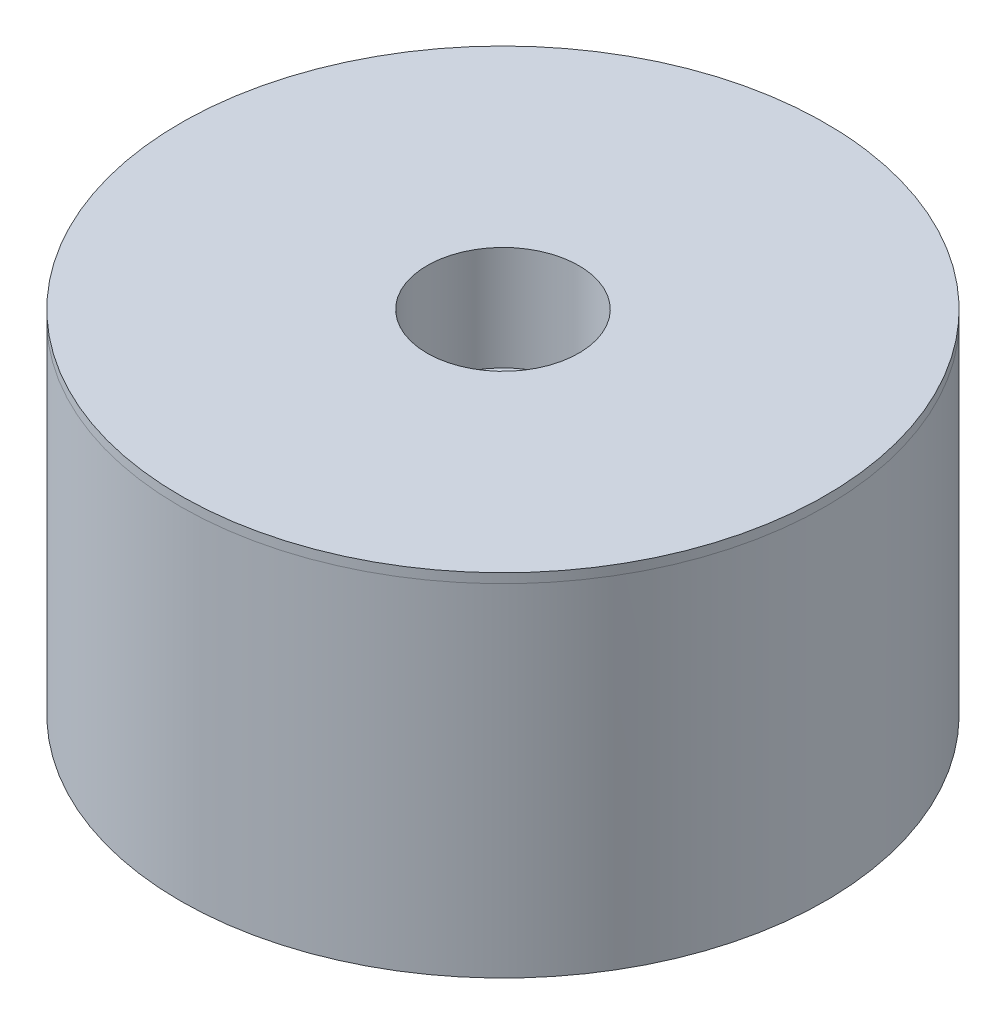
ISO-10303-21;
HEADER;
FILE_DESCRIPTION(('STEP AP214'),'2;1');
FILE_NAME('part.step','',(''),(''),'','','');
FILE_SCHEMA(('AUTOMOTIVE_DESIGN { 1 0 10303 214 1 1 1 1 }'));
ENDSEC;
DATA;
#1=APPLICATION_CONTEXT('core data for automotive mechanical design processes');
#2=APPLICATION_PROTOCOL_DEFINITION('international standard','automotive_design',2000,#1);
#3=PRODUCT_CONTEXT('',#1,'mechanical');
#4=PRODUCT('Part','Part','',(#3));
#5=PRODUCT_RELATED_PRODUCT_CATEGORY('part','',(#4));
#6=PRODUCT_DEFINITION_FORMATION('','',#4);
#7=PRODUCT_DEFINITION_CONTEXT('part definition',#1,'design');
#8=PRODUCT_DEFINITION('design','',#6,#7);
#9=PRODUCT_DEFINITION_SHAPE('','',#8);
#10=(LENGTH_UNIT() NAMED_UNIT(*) SI_UNIT(.MILLI.,.METRE.));
#11=(NAMED_UNIT(*) PLANE_ANGLE_UNIT() SI_UNIT($,.RADIAN.));
#12=(NAMED_UNIT(*) SI_UNIT($,.STERADIAN.) SOLID_ANGLE_UNIT());
#13=UNCERTAINTY_MEASURE_WITH_UNIT(LENGTH_MEASURE(1.E-05),#10,'distance_accuracy_value','');
#14=(GEOMETRIC_REPRESENTATION_CONTEXT(3) GLOBAL_UNCERTAINTY_ASSIGNED_CONTEXT((#13)) GLOBAL_UNIT_ASSIGNED_CONTEXT((#10,
#11,#12)) REPRESENTATION_CONTEXT('',''));
#15=CARTESIAN_POINT('',(0.,0.,0.));
#16=DIRECTION('',(0.,0.,1.));
#17=DIRECTION('',(1.,0.,0.));
#18=AXIS2_PLACEMENT_3D('',#15,#16,#17);
#19=CARTESIAN_POINT('',(0.,-46.,0.));
#20=DIRECTION('',(0.,1.,0.));
#21=DIRECTION('',(0.,0.,1.));
#22=AXIS2_PLACEMENT_3D('',#19,#20,#21);
#23=CYLINDRICAL_SURFACE('',#22,2.75);
#24=CARTESIAN_POINT('',(0.,0.,0.));
#25=DIRECTION('',(0.,1.,0.));
#26=DIRECTION('',(0.,0.,1.));
#27=AXIS2_PLACEMENT_3D('',#24,#25,#26);
#28=CIRCLE('',#27,2.75);
#29=CARTESIAN_POINT('',(0.,0.,2.75));
#30=VERTEX_POINT('',#29);
#31=EDGE_CURVE('E58',#30,#30,#28,.T.);
#32=ORIENTED_EDGE('',*,*,#31,.F.);
#33=EDGE_LOOP('',(#32));
#34=FACE_BOUND('',#33,.T.);
#35=CARTESIAN_POINT('',(0.,13.,0.));
#36=DIRECTION('',(0.,1.,0.));
#37=DIRECTION('',(0.,0.,1.));
#38=AXIS2_PLACEMENT_3D('',#35,#36,#37);
#39=CIRCLE('',#38,2.75);
#40=CARTESIAN_POINT('',(0.,13.,2.75));
#41=VERTEX_POINT('',#40);
#42=EDGE_CURVE('E49',#41,#41,#39,.F.);
#43=ORIENTED_EDGE('',*,*,#42,.F.);
#44=EDGE_LOOP('',(#43));
#45=FACE_BOUND('',#44,.T.);
#46=ADVANCED_FACE('F45',(#34,#45),#23,.F.);
#47=CARTESIAN_POINT('',(0.,18.,0.));
#48=DIRECTION('',(0.,-1.,0.));
#49=DIRECTION('',(0.,0.,-1.));
#50=AXIS2_PLACEMENT_3D('',#47,#48,#49);
#51=CYLINDRICAL_SURFACE('',#50,17.);
#52=CARTESIAN_POINT('',(0.,18.,0.));
#53=DIRECTION('',(0.,1.,0.));
#54=DIRECTION('',(0.,0.,1.));
#55=AXIS2_PLACEMENT_3D('',#52,#53,#54);
#56=CIRCLE('',#55,17.);
#57=CARTESIAN_POINT('',(0.,18.,17.));
#58=VERTEX_POINT('',#57);
#59=EDGE_CURVE('E10',#58,#58,#56,.T.);
#60=ORIENTED_EDGE('',*,*,#59,.F.);
#61=EDGE_LOOP('',(#60));
#62=FACE_BOUND('',#61,.T.);
#63=CARTESIAN_POINT('',(0.,0.,0.));
#64=DIRECTION('',(0.,1.,0.));
#65=DIRECTION('',(0.,0.,1.));
#66=AXIS2_PLACEMENT_3D('',#63,#64,#65);
#67=CIRCLE('',#66,17.);
#68=CARTESIAN_POINT('',(0.,0.,17.));
#69=VERTEX_POINT('',#68);
#70=EDGE_CURVE('E53',#69,#69,#67,.T.);
#71=ORIENTED_EDGE('',*,*,#70,.T.);
#72=EDGE_LOOP('',(#71));
#73=FACE_BOUND('',#72,.T.);
#74=ADVANCED_FACE('F47',(#62,#73),#51,.T.);
#75=CARTESIAN_POINT('',(0.,0.,0.));
#76=DIRECTION('',(0.,1.,0.));
#77=DIRECTION('',(0.,0.,1.));
#78=AXIS2_PLACEMENT_3D('',#75,#76,#77);
#79=PLANE('',#78);
#80=ORIENTED_EDGE('',*,*,#31,.T.);
#81=EDGE_LOOP('',(#80));
#82=FACE_BOUND('',#81,.T.);
#83=ORIENTED_EDGE('',*,*,#70,.F.);
#84=EDGE_LOOP('',(#83));
#85=FACE_BOUND('',#84,.T.);
#86=ADVANCED_FACE('F91',(#82,#85),#79,.F.);
#87=CARTESIAN_POINT('',(0.,13.,0.));
#88=DIRECTION('',(0.,1.,0.));
#89=DIRECTION('',(0.,0.,1.));
#90=AXIS2_PLACEMENT_3D('',#87,#88,#89);
#91=PLANE('',#90);
#92=CARTESIAN_POINT('',(0.,13.,0.));
#93=DIRECTION('',(0.,1.,0.));
#94=DIRECTION('',(0.,0.,1.));
#95=AXIS2_PLACEMENT_3D('',#92,#93,#94);
#96=CIRCLE('',#95,4.);
#97=CARTESIAN_POINT('',(0.,13.,4.));
#98=VERTEX_POINT('',#97);
#99=EDGE_CURVE('E61',#98,#98,#96,.T.);
#100=ORIENTED_EDGE('',*,*,#99,.T.);
#101=EDGE_LOOP('',(#100));
#102=FACE_BOUND('',#101,.T.);
#103=ORIENTED_EDGE('',*,*,#42,.T.);
#104=EDGE_LOOP('',(#103));
#105=FACE_BOUND('',#104,.T.);
#106=ADVANCED_FACE('F88',(#102,#105),#91,.T.);
#107=CARTESIAN_POINT('',(0.,13.,0.));
#108=DIRECTION('',(0.,1.,0.));
#109=DIRECTION('',(0.,0.,1.));
#110=AXIS2_PLACEMENT_3D('',#107,#108,#109);
#111=CYLINDRICAL_SURFACE('',#110,4.);
#112=ORIENTED_EDGE('',*,*,#99,.F.);
#113=EDGE_LOOP('',(#112));
#114=FACE_BOUND('',#113,.T.);
#115=CARTESIAN_POINT('',(0.,18.5,0.));
#116=DIRECTION('',(0.,1.,0.));
#117=DIRECTION('',(0.,0.,1.));
#118=AXIS2_PLACEMENT_3D('',#115,#116,#117);
#119=CIRCLE('',#118,4.);
#120=CARTESIAN_POINT('',(0.,18.5,4.));
#121=VERTEX_POINT('',#120);
#122=EDGE_CURVE('E74',#121,#121,#119,.T.);
#123=ORIENTED_EDGE('',*,*,#122,.T.);
#124=EDGE_LOOP('',(#123));
#125=FACE_BOUND('',#124,.T.);
#126=ADVANCED_FACE('F86',(#114,#125),#111,.F.);
#127=CARTESIAN_POINT('',(0.,18.5,0.));
#128=DIRECTION('',(0.,1.,0.));
#129=DIRECTION('',(0.049112097957597,0.,-0.99879327282186));
#130=AXIS2_PLACEMENT_3D('',#127,#128,#129);
#131=ELLIPSE('',#130,17.,17.);
#132=DIRECTION('',(0.,-1.,0.));
#133=VECTOR('',#132,1.);
#134=SURFACE_OF_LINEAR_EXTRUSION('',#131,#133);
#135=CARTESIAN_POINT('',(0.834905665279149,18.5,-16.9794856379716));
#136=VERTEX_POINT('',#135);
#137=EDGE_CURVE('E70',#136,#136,#131,.T.);
#138=ORIENTED_EDGE('',*,*,#137,.F.);
#139=EDGE_LOOP('',(#138));
#140=FACE_BOUND('',#139,.T.);
#141=ORIENTED_EDGE('',*,*,#59,.T.);
#142=EDGE_LOOP('',(#141));
#143=FACE_BOUND('',#142,.T.);
#144=ADVANCED_FACE('F81',(#140,#143),#134,.F.);
#145=CARTESIAN_POINT('',(0.,18.5,0.));
#146=DIRECTION('',(0.,1.,0.));
#147=DIRECTION('',(0.,0.,1.));
#148=AXIS2_PLACEMENT_3D('',#145,#146,#147);
#149=PLANE('',#148);
#150=ORIENTED_EDGE('',*,*,#122,.F.);
#151=EDGE_LOOP('',(#150));
#152=FACE_BOUND('',#151,.T.);
#153=ORIENTED_EDGE('',*,*,#137,.T.);
#154=EDGE_LOOP('',(#153));
#155=FACE_BOUND('',#154,.T.);
#156=ADVANCED_FACE('F85',(#152,#155),#149,.T.);
#157=CLOSED_SHELL('',(#46,#74,#86,#106,#126,#144,#156));
#158=MANIFOLD_SOLID_BREP('B2',#157);
#159=ADVANCED_BREP_SHAPE_REPRESENTATION('',(#18,#158),#14);
#160=SHAPE_DEFINITION_REPRESENTATION(#9,#159);
ENDSEC;
END-ISO-10303-21;
